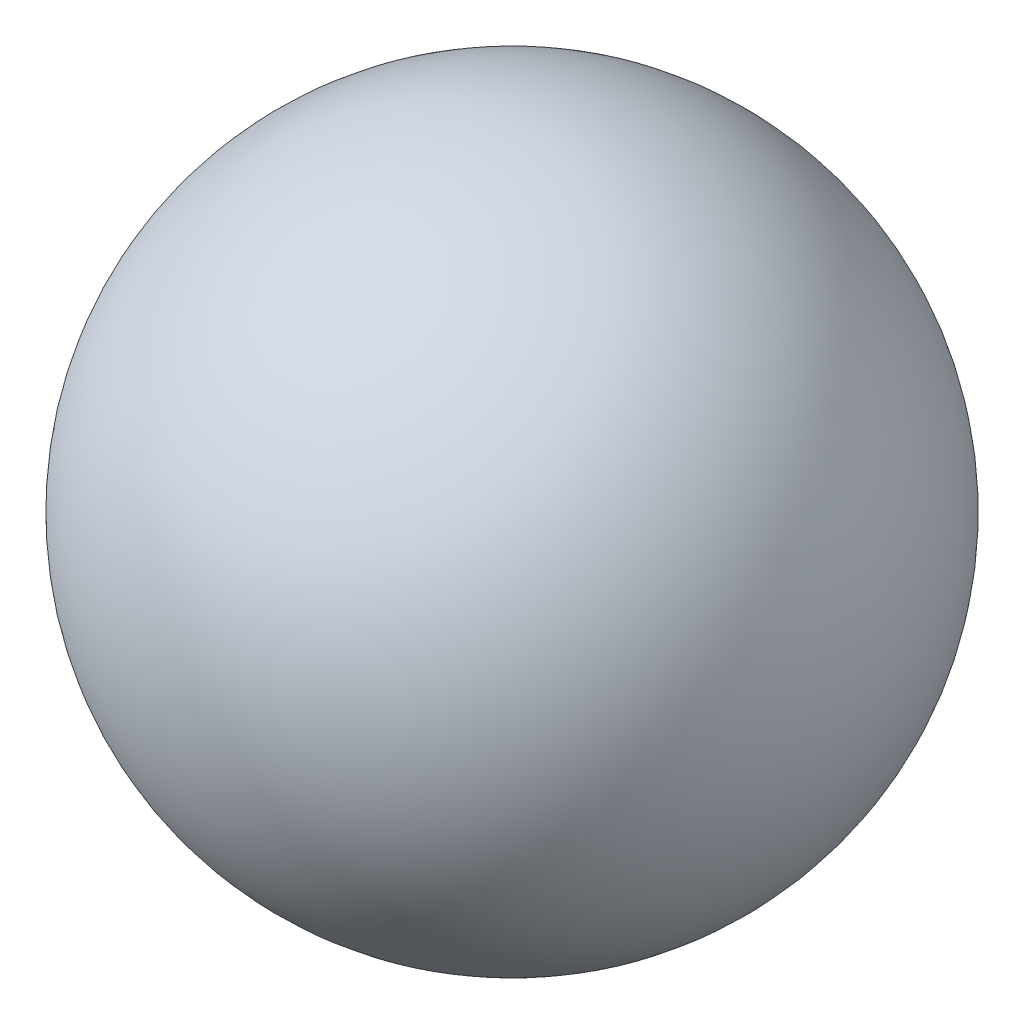
ISO-10303-21;
HEADER;
FILE_DESCRIPTION(('STEP AP214'),'2;1');
FILE_NAME('part.step','',(''),(''),'','','');
FILE_SCHEMA(('AUTOMOTIVE_DESIGN { 1 0 10303 214 1 1 1 1 }'));
ENDSEC;
DATA;
#1=APPLICATION_CONTEXT('core data for automotive mechanical design processes');
#2=APPLICATION_PROTOCOL_DEFINITION('international standard','automotive_design',2000,#1);
#3=PRODUCT_CONTEXT('',#1,'mechanical');
#4=PRODUCT('Part','Part','',(#3));
#5=PRODUCT_RELATED_PRODUCT_CATEGORY('part','',(#4));
#6=PRODUCT_DEFINITION_FORMATION('','',#4);
#7=PRODUCT_DEFINITION_CONTEXT('part definition',#1,'design');
#8=PRODUCT_DEFINITION('design','',#6,#7);
#9=PRODUCT_DEFINITION_SHAPE('','',#8);
#10=(LENGTH_UNIT() NAMED_UNIT(*) SI_UNIT(.MILLI.,.METRE.));
#11=(NAMED_UNIT(*) PLANE_ANGLE_UNIT() SI_UNIT($,.RADIAN.));
#12=(NAMED_UNIT(*) SI_UNIT($,.STERADIAN.) SOLID_ANGLE_UNIT());
#13=UNCERTAINTY_MEASURE_WITH_UNIT(LENGTH_MEASURE(1.E-05),#10,'distance_accuracy_value','');
#14=(GEOMETRIC_REPRESENTATION_CONTEXT(3) GLOBAL_UNCERTAINTY_ASSIGNED_CONTEXT((#13)) GLOBAL_UNIT_ASSIGNED_CONTEXT((#10,
#11,#12)) REPRESENTATION_CONTEXT('',''));
#15=CARTESIAN_POINT('',(0.,0.,0.));
#16=DIRECTION('',(0.,0.,1.));
#17=DIRECTION('',(1.,0.,0.));
#18=AXIS2_PLACEMENT_3D('',#15,#16,#17);
#19=CARTESIAN_POINT('',(2.,2.75,0.));
#20=DIRECTION('',(0.,1.,0.));
#21=DIRECTION('',(1.,0.,0.));
#22=AXIS2_PLACEMENT_3D('',#19,#20,#21);
#23=SPHERICAL_SURFACE('',#22,0.95);
#24=CARTESIAN_POINT('',(2.,3.7,0.));
#25=VERTEX_POINT('',#24);
#26=VERTEX_LOOP('',#25);
#27=FACE_BOUND('',#26,.T.);
#28=ADVANCED_FACE('F28',(#27),#23,.T.);
#29=CLOSED_SHELL('',(#28));
#30=MANIFOLD_SOLID_BREP('B2',#29);
#31=ADVANCED_BREP_SHAPE_REPRESENTATION('',(#18,#30),#14);
#32=SHAPE_DEFINITION_REPRESENTATION(#9,#31);
ENDSEC;
END-ISO-10303-21;
